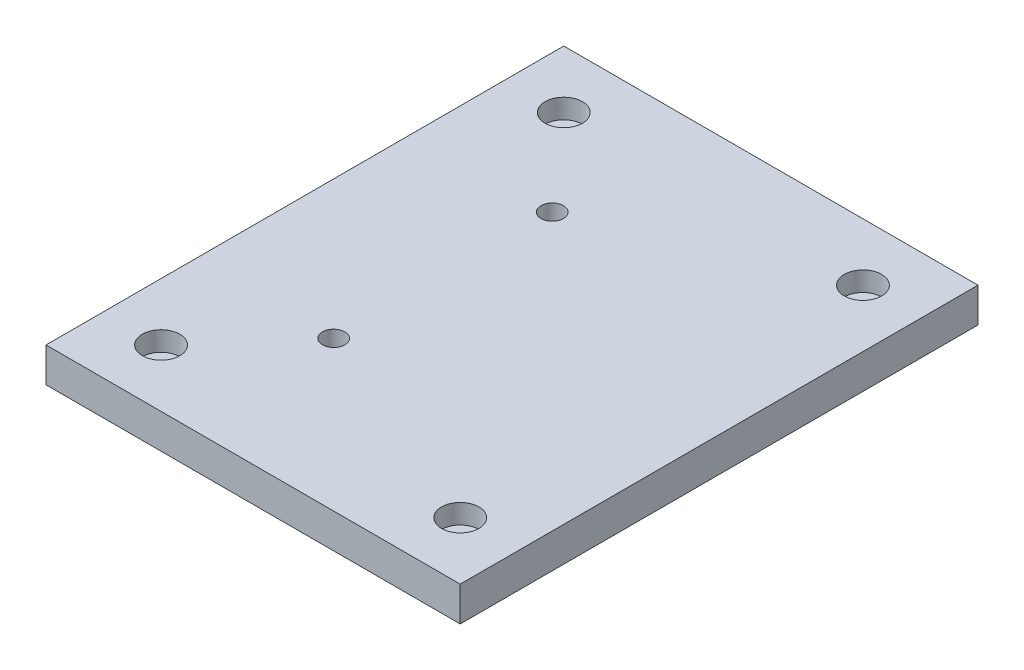
ISO-10303-21;
HEADER;
FILE_DESCRIPTION(('STEP AP214'),'2;1');
FILE_NAME('part.step','',(''),(''),'','','');
FILE_SCHEMA(('AUTOMOTIVE_DESIGN { 1 0 10303 214 1 1 1 1 }'));
ENDSEC;
DATA;
#1=APPLICATION_CONTEXT('core data for automotive mechanical design processes');
#2=APPLICATION_PROTOCOL_DEFINITION('international standard','automotive_design',2000,#1);
#3=PRODUCT_CONTEXT('',#1,'mechanical');
#4=PRODUCT('Part','Part','',(#3));
#5=PRODUCT_RELATED_PRODUCT_CATEGORY('part','',(#4));
#6=PRODUCT_DEFINITION_FORMATION('','',#4);
#7=PRODUCT_DEFINITION_CONTEXT('part definition',#1,'design');
#8=PRODUCT_DEFINITION('design','',#6,#7);
#9=PRODUCT_DEFINITION_SHAPE('','',#8);
#10=(LENGTH_UNIT() NAMED_UNIT(*) SI_UNIT(.MILLI.,.METRE.));
#11=(NAMED_UNIT(*) PLANE_ANGLE_UNIT() SI_UNIT($,.RADIAN.));
#12=(NAMED_UNIT(*) SI_UNIT($,.STERADIAN.) SOLID_ANGLE_UNIT());
#13=UNCERTAINTY_MEASURE_WITH_UNIT(LENGTH_MEASURE(1.E-05),#10,'distance_accuracy_value','');
#14=(GEOMETRIC_REPRESENTATION_CONTEXT(3) GLOBAL_UNCERTAINTY_ASSIGNED_CONTEXT((#13)) GLOBAL_UNIT_ASSIGNED_CONTEXT((#10,
#11,#12)) REPRESENTATION_CONTEXT('',''));
#15=CARTESIAN_POINT('',(0.,0.,0.));
#16=DIRECTION('',(0.,0.,1.));
#17=DIRECTION('',(1.,0.,0.));
#18=AXIS2_PLACEMENT_3D('',#15,#16,#17);
#19=CARTESIAN_POINT('',(-36.,6.,-45.));
#20=DIRECTION('',(1.,0.,0.));
#21=DIRECTION('',(0.,0.,-1.));
#22=AXIS2_PLACEMENT_3D('',#19,#20,#21);
#23=PLANE('',#22);
#24=DIRECTION('',(0.,0.,1.));
#25=VECTOR('',#24,1.);
#26=CARTESIAN_POINT('',(-36.,0.,-45.));
#27=LINE('',#26,#25);
#28=CARTESIAN_POINT('',(-36.,0.,-45.));
#29=VERTEX_POINT('',#28);
#30=CARTESIAN_POINT('',(-36.,0.,45.));
#31=VERTEX_POINT('',#30);
#32=EDGE_CURVE('E116',#29,#31,#27,.T.);
#33=ORIENTED_EDGE('',*,*,#32,.T.);
#34=DIRECTION('',(0.,-1.,0.));
#35=VECTOR('',#34,1.);
#36=CARTESIAN_POINT('',(-36.,6.,45.));
#37=LINE('',#36,#35);
#38=CARTESIAN_POINT('',(-36.,6.,45.));
#39=VERTEX_POINT('',#38);
#40=EDGE_CURVE('E11',#39,#31,#37,.T.);
#41=ORIENTED_EDGE('',*,*,#40,.F.);
#42=DIRECTION('',(0.,0.,1.));
#43=VECTOR('',#42,1.);
#44=CARTESIAN_POINT('',(-36.,6.,-45.));
#45=LINE('',#44,#43);
#46=CARTESIAN_POINT('',(-36.,6.,-45.));
#47=VERTEX_POINT('',#46);
#48=EDGE_CURVE('E99',#47,#39,#45,.T.);
#49=ORIENTED_EDGE('',*,*,#48,.F.);
#50=DIRECTION('',(0.,-1.,0.));
#51=VECTOR('',#50,1.);
#52=CARTESIAN_POINT('',(-36.,6.,-45.));
#53=LINE('',#52,#51);
#54=EDGE_CURVE('E112',#47,#29,#53,.T.);
#55=ORIENTED_EDGE('',*,*,#54,.T.);
#56=EDGE_LOOP('',(#33,#41,#49,#55));
#57=FACE_BOUND('',#56,.T.);
#58=ADVANCED_FACE('F45',(#57),#23,.F.);
#59=CARTESIAN_POINT('',(-36.,6.,45.));
#60=DIRECTION('',(0.,0.,-1.));
#61=DIRECTION('',(-1.,0.,0.));
#62=AXIS2_PLACEMENT_3D('',#59,#60,#61);
#63=PLANE('',#62);
#64=DIRECTION('',(1.,0.,0.));
#65=VECTOR('',#64,1.);
#66=CARTESIAN_POINT('',(-36.,0.,45.));
#67=LINE('',#66,#65);
#68=CARTESIAN_POINT('',(36.,0.,45.));
#69=VERTEX_POINT('',#68);
#70=EDGE_CURVE('E104',#31,#69,#67,.T.);
#71=ORIENTED_EDGE('',*,*,#70,.T.);
#72=DIRECTION('',(0.,-1.,0.));
#73=VECTOR('',#72,1.);
#74=CARTESIAN_POINT('',(36.,6.,45.));
#75=LINE('',#74,#73);
#76=CARTESIAN_POINT('',(36.,6.,45.));
#77=VERTEX_POINT('',#76);
#78=EDGE_CURVE('E55',#77,#69,#75,.T.);
#79=ORIENTED_EDGE('',*,*,#78,.F.);
#80=DIRECTION('',(1.,0.,0.));
#81=VECTOR('',#80,1.);
#82=CARTESIAN_POINT('',(-36.,6.,45.));
#83=LINE('',#82,#81);
#84=EDGE_CURVE('E94',#39,#77,#83,.T.);
#85=ORIENTED_EDGE('',*,*,#84,.F.);
#86=ORIENTED_EDGE('',*,*,#40,.T.);
#87=EDGE_LOOP('',(#71,#79,#85,#86));
#88=FACE_BOUND('',#87,.T.);
#89=ADVANCED_FACE('F103',(#88),#63,.F.);
#90=CARTESIAN_POINT('',(36.,6.,-45.));
#91=DIRECTION('',(-1.,0.,0.));
#92=DIRECTION('',(0.,0.,1.));
#93=AXIS2_PLACEMENT_3D('',#90,#91,#92);
#94=PLANE('',#93);
#95=DIRECTION('',(0.,0.,-1.));
#96=VECTOR('',#95,1.);
#97=CARTESIAN_POINT('',(36.,0.,-45.));
#98=LINE('',#97,#96);
#99=CARTESIAN_POINT('',(36.,0.,-45.));
#100=VERTEX_POINT('',#99);
#101=EDGE_CURVE('E81',#69,#100,#98,.T.);
#102=ORIENTED_EDGE('',*,*,#101,.T.);
#103=DIRECTION('',(0.,-1.,0.));
#104=VECTOR('',#103,1.);
#105=CARTESIAN_POINT('',(36.,6.,-45.));
#106=LINE('',#105,#104);
#107=CARTESIAN_POINT('',(36.,6.,-45.));
#108=VERTEX_POINT('',#107);
#109=EDGE_CURVE('E106',#108,#100,#106,.T.);
#110=ORIENTED_EDGE('',*,*,#109,.F.);
#111=DIRECTION('',(0.,0.,-1.));
#112=VECTOR('',#111,1.);
#113=CARTESIAN_POINT('',(36.,6.,-45.));
#114=LINE('',#113,#112);
#115=EDGE_CURVE('E97',#77,#108,#114,.T.);
#116=ORIENTED_EDGE('',*,*,#115,.F.);
#117=ORIENTED_EDGE('',*,*,#78,.T.);
#118=EDGE_LOOP('',(#102,#110,#116,#117));
#119=FACE_BOUND('',#118,.T.);
#120=ADVANCED_FACE('F108',(#119),#94,.F.);
#121=CARTESIAN_POINT('',(-36.,6.,-45.));
#122=DIRECTION('',(0.,0.,1.));
#123=DIRECTION('',(1.,0.,0.));
#124=AXIS2_PLACEMENT_3D('',#121,#122,#123);
#125=PLANE('',#124);
#126=DIRECTION('',(-1.,0.,0.));
#127=VECTOR('',#126,1.);
#128=CARTESIAN_POINT('',(-36.,0.,-45.));
#129=LINE('',#128,#127);
#130=EDGE_CURVE('E87',#100,#29,#129,.T.);
#131=ORIENTED_EDGE('',*,*,#130,.T.);
#132=ORIENTED_EDGE('',*,*,#54,.F.);
#133=DIRECTION('',(-1.,0.,0.));
#134=VECTOR('',#133,1.);
#135=CARTESIAN_POINT('',(-36.,6.,-45.));
#136=LINE('',#135,#134);
#137=EDGE_CURVE('E64',#108,#47,#136,.T.);
#138=ORIENTED_EDGE('',*,*,#137,.F.);
#139=ORIENTED_EDGE('',*,*,#109,.T.);
#140=EDGE_LOOP('',(#131,#132,#138,#139));
#141=FACE_BOUND('',#140,.T.);
#142=ADVANCED_FACE('F199',(#141),#125,.F.);
#143=CARTESIAN_POINT('',(0.,6.,0.));
#144=DIRECTION('',(0.,1.,0.));
#145=DIRECTION('',(0.,0.,1.));
#146=AXIS2_PLACEMENT_3D('',#143,#144,#145);
#147=PLANE('',#146);
#148=CARTESIAN_POINT('',(-12.,6.,19.));
#149=DIRECTION('',(0.,1.,0.));
#150=DIRECTION('',(0.,0.,1.));
#151=AXIS2_PLACEMENT_3D('',#148,#149,#150);
#152=CIRCLE('',#151,1.95);
#153=CARTESIAN_POINT('',(-12.,6.,20.95));
#154=VERTEX_POINT('',#153);
#155=EDGE_CURVE('E355',#154,#154,#152,.T.);
#156=ORIENTED_EDGE('',*,*,#155,.F.);
#157=EDGE_LOOP('',(#156));
#158=FACE_BOUND('',#157,.T.);
#159=CARTESIAN_POINT('',(-12.,6.,-19.));
#160=DIRECTION('',(0.,1.,0.));
#161=DIRECTION('',(0.,0.,1.));
#162=AXIS2_PLACEMENT_3D('',#159,#160,#161);
#163=CIRCLE('',#162,1.95);
#164=CARTESIAN_POINT('',(-12.,6.,-17.05));
#165=VERTEX_POINT('',#164);
#166=EDGE_CURVE('E359',#165,#165,#163,.T.);
#167=ORIENTED_EDGE('',*,*,#166,.F.);
#168=EDGE_LOOP('',(#167));
#169=FACE_BOUND('',#168,.T.);
#170=CARTESIAN_POINT('',(-26.,6.,-35.));
#171=DIRECTION('',(0.,1.,0.));
#172=DIRECTION('',(0.,0.,1.));
#173=AXIS2_PLACEMENT_3D('',#170,#171,#172);
#174=CIRCLE('',#173,3.25);
#175=CARTESIAN_POINT('',(-26.,6.,-31.75));
#176=VERTEX_POINT('',#175);
#177=EDGE_CURVE('E369',#176,#176,#174,.T.);
#178=ORIENTED_EDGE('',*,*,#177,.F.);
#179=EDGE_LOOP('',(#178));
#180=FACE_BOUND('',#179,.T.);
#181=CARTESIAN_POINT('',(26.,6.,-35.));
#182=DIRECTION('',(0.,1.,0.));
#183=DIRECTION('',(0.,0.,1.));
#184=AXIS2_PLACEMENT_3D('',#181,#182,#183);
#185=CIRCLE('',#184,3.25);
#186=CARTESIAN_POINT('',(26.,6.,-31.75));
#187=VERTEX_POINT('',#186);
#188=EDGE_CURVE('E159',#187,#187,#185,.T.);
#189=ORIENTED_EDGE('',*,*,#188,.F.);
#190=EDGE_LOOP('',(#189));
#191=FACE_BOUND('',#190,.T.);
#192=CARTESIAN_POINT('',(26.,6.,35.));
#193=DIRECTION('',(0.,1.,0.));
#194=DIRECTION('',(0.,0.,1.));
#195=AXIS2_PLACEMENT_3D('',#192,#193,#194);
#196=CIRCLE('',#195,3.25);
#197=CARTESIAN_POINT('',(26.,6.,38.25));
#198=VERTEX_POINT('',#197);
#199=EDGE_CURVE('E143',#198,#198,#196,.T.);
#200=ORIENTED_EDGE('',*,*,#199,.F.);
#201=EDGE_LOOP('',(#200));
#202=FACE_BOUND('',#201,.T.);
#203=CARTESIAN_POINT('',(-26.,6.,35.));
#204=DIRECTION('',(0.,1.,0.));
#205=DIRECTION('',(0.,0.,1.));
#206=AXIS2_PLACEMENT_3D('',#203,#204,#205);
#207=CIRCLE('',#206,3.25);
#208=CARTESIAN_POINT('',(-26.,6.,38.25));
#209=VERTEX_POINT('',#208);
#210=EDGE_CURVE('E138',#209,#209,#207,.T.);
#211=ORIENTED_EDGE('',*,*,#210,.F.);
#212=EDGE_LOOP('',(#211));
#213=FACE_BOUND('',#212,.T.);
#214=ORIENTED_EDGE('',*,*,#48,.T.);
#215=ORIENTED_EDGE('',*,*,#84,.T.);
#216=ORIENTED_EDGE('',*,*,#115,.T.);
#217=ORIENTED_EDGE('',*,*,#137,.T.);
#218=EDGE_LOOP('',(#214,#215,#216,#217));
#219=FACE_BOUND('',#218,.T.);
#220=ADVANCED_FACE('F95',(#158,#169,#180,#191,#202,#213,#219),#147,.T.);
#221=CARTESIAN_POINT('',(0.,0.,0.));
#222=DIRECTION('',(0.,1.,0.));
#223=DIRECTION('',(0.,0.,1.));
#224=AXIS2_PLACEMENT_3D('',#221,#222,#223);
#225=PLANE('',#224);
#226=CARTESIAN_POINT('',(-12.,0.,19.));
#227=DIRECTION('',(0.,1.,0.));
#228=DIRECTION('',(0.,0.,1.));
#229=AXIS2_PLACEMENT_3D('',#226,#227,#228);
#230=CIRCLE('',#229,1.95);
#231=CARTESIAN_POINT('',(-12.,0.,20.95));
#232=VERTEX_POINT('',#231);
#233=EDGE_CURVE('E353',#232,#232,#230,.T.);
#234=ORIENTED_EDGE('',*,*,#233,.T.);
#235=EDGE_LOOP('',(#234));
#236=FACE_BOUND('',#235,.T.);
#237=CARTESIAN_POINT('',(-12.,0.,-19.));
#238=DIRECTION('',(0.,1.,0.));
#239=DIRECTION('',(0.,0.,1.));
#240=AXIS2_PLACEMENT_3D('',#237,#238,#239);
#241=CIRCLE('',#240,1.95);
#242=CARTESIAN_POINT('',(-12.,0.,-17.05));
#243=VERTEX_POINT('',#242);
#244=EDGE_CURVE('E365',#243,#243,#241,.T.);
#245=ORIENTED_EDGE('',*,*,#244,.T.);
#246=EDGE_LOOP('',(#245));
#247=FACE_BOUND('',#246,.T.);
#248=CARTESIAN_POINT('',(-26.,0.,-35.));
#249=DIRECTION('',(0.,1.,0.));
#250=DIRECTION('',(0.,0.,1.));
#251=AXIS2_PLACEMENT_3D('',#248,#249,#250);
#252=CIRCLE('',#251,1.6);
#253=CARTESIAN_POINT('',(-26.,0.,-33.4));
#254=VERTEX_POINT('',#253);
#255=EDGE_CURVE('E48',#254,#254,#252,.T.);
#256=ORIENTED_EDGE('',*,*,#255,.T.);
#257=EDGE_LOOP('',(#256));
#258=FACE_BOUND('',#257,.T.);
#259=CARTESIAN_POINT('',(26.,0.,-35.));
#260=DIRECTION('',(0.,1.,0.));
#261=DIRECTION('',(0.,0.,1.));
#262=AXIS2_PLACEMENT_3D('',#259,#260,#261);
#263=CIRCLE('',#262,1.6);
#264=CARTESIAN_POINT('',(26.,0.,-33.4));
#265=VERTEX_POINT('',#264);
#266=EDGE_CURVE('E140',#265,#265,#263,.T.);
#267=ORIENTED_EDGE('',*,*,#266,.T.);
#268=EDGE_LOOP('',(#267));
#269=FACE_BOUND('',#268,.T.);
#270=CARTESIAN_POINT('',(26.,0.,35.));
#271=DIRECTION('',(0.,1.,0.));
#272=DIRECTION('',(0.,0.,1.));
#273=AXIS2_PLACEMENT_3D('',#270,#271,#272);
#274=CIRCLE('',#273,1.6);
#275=CARTESIAN_POINT('',(26.,0.,36.6));
#276=VERTEX_POINT('',#275);
#277=EDGE_CURVE('E135',#276,#276,#274,.T.);
#278=ORIENTED_EDGE('',*,*,#277,.T.);
#279=EDGE_LOOP('',(#278));
#280=FACE_BOUND('',#279,.T.);
#281=CARTESIAN_POINT('',(-26.,0.,35.));
#282=DIRECTION('',(0.,1.,0.));
#283=DIRECTION('',(0.,0.,1.));
#284=AXIS2_PLACEMENT_3D('',#281,#282,#283);
#285=CIRCLE('',#284,1.6);
#286=CARTESIAN_POINT('',(-26.,0.,36.6));
#287=VERTEX_POINT('',#286);
#288=EDGE_CURVE('E120',#287,#287,#285,.T.);
#289=ORIENTED_EDGE('',*,*,#288,.T.);
#290=EDGE_LOOP('',(#289));
#291=FACE_BOUND('',#290,.T.);
#292=ORIENTED_EDGE('',*,*,#32,.F.);
#293=ORIENTED_EDGE('',*,*,#130,.F.);
#294=ORIENTED_EDGE('',*,*,#101,.F.);
#295=ORIENTED_EDGE('',*,*,#70,.F.);
#296=EDGE_LOOP('',(#292,#293,#294,#295));
#297=FACE_BOUND('',#296,.T.);
#298=ADVANCED_FACE('F198',(#236,#247,#258,#269,#280,#291,#297),#225,.F.);
#299=CARTESIAN_POINT('',(-26.,6.,35.));
#300=DIRECTION('',(0.,1.,0.));
#301=DIRECTION('',(0.,0.,1.));
#302=AXIS2_PLACEMENT_3D('',#299,#300,#301);
#303=CYLINDRICAL_SURFACE('',#302,1.6);
#304=CARTESIAN_POINT('',(-26.,2.6,35.));
#305=DIRECTION('',(0.,1.,0.));
#306=DIRECTION('',(0.,0.,1.));
#307=AXIS2_PLACEMENT_3D('',#304,#305,#306);
#308=CIRCLE('',#307,1.6);
#309=CARTESIAN_POINT('',(-26.,2.6,36.6));
#310=VERTEX_POINT('',#309);
#311=EDGE_CURVE('E134',#310,#310,#308,.T.);
#312=ORIENTED_EDGE('',*,*,#311,.T.);
#313=EDGE_LOOP('',(#312));
#314=FACE_BOUND('',#313,.T.);
#315=ORIENTED_EDGE('',*,*,#288,.F.);
#316=EDGE_LOOP('',(#315));
#317=FACE_BOUND('',#316,.T.);
#318=ADVANCED_FACE('F181',(#314,#317),#303,.F.);
#319=CARTESIAN_POINT('',(-24.4,2.6,35.));
#320=DIRECTION('',(0.,-1.,0.));
#321=DIRECTION('',(0.,0.,-1.));
#322=AXIS2_PLACEMENT_3D('',#319,#320,#321);
#323=PLANE('',#322);
#324=ORIENTED_EDGE('',*,*,#311,.F.);
#325=EDGE_LOOP('',(#324));
#326=FACE_BOUND('',#325,.T.);
#327=CARTESIAN_POINT('',(-26.,2.6,35.));
#328=DIRECTION('',(0.,1.,0.));
#329=DIRECTION('',(0.,0.,1.));
#330=AXIS2_PLACEMENT_3D('',#327,#328,#329);
#331=CIRCLE('',#330,3.25);
#332=CARTESIAN_POINT('',(-26.,2.6,38.25));
#333=VERTEX_POINT('',#332);
#334=EDGE_CURVE('E172',#333,#333,#331,.T.);
#335=ORIENTED_EDGE('',*,*,#334,.T.);
#336=EDGE_LOOP('',(#335));
#337=FACE_BOUND('',#336,.T.);
#338=ADVANCED_FACE('F184',(#326,#337),#323,.F.);
#339=CARTESIAN_POINT('',(-26.,6.,35.));
#340=DIRECTION('',(0.,1.,0.));
#341=DIRECTION('',(0.,0.,1.));
#342=AXIS2_PLACEMENT_3D('',#339,#340,#341);
#343=CYLINDRICAL_SURFACE('',#342,3.25);
#344=ORIENTED_EDGE('',*,*,#334,.F.);
#345=EDGE_LOOP('',(#344));
#346=FACE_BOUND('',#345,.T.);
#347=ORIENTED_EDGE('',*,*,#210,.T.);
#348=EDGE_LOOP('',(#347));
#349=FACE_BOUND('',#348,.T.);
#350=ADVANCED_FACE('F187',(#346,#349),#343,.F.);
#351=CARTESIAN_POINT('',(26.,6.,35.));
#352=DIRECTION('',(0.,1.,0.));
#353=DIRECTION('',(0.,0.,1.));
#354=AXIS2_PLACEMENT_3D('',#351,#352,#353);
#355=CYLINDRICAL_SURFACE('',#354,1.6);
#356=CARTESIAN_POINT('',(26.,2.6,35.));
#357=DIRECTION('',(0.,1.,0.));
#358=DIRECTION('',(0.,0.,1.));
#359=AXIS2_PLACEMENT_3D('',#356,#357,#358);
#360=CIRCLE('',#359,1.6);
#361=CARTESIAN_POINT('',(26.,2.6,36.6));
#362=VERTEX_POINT('',#361);
#363=EDGE_CURVE('E139',#362,#362,#360,.T.);
#364=ORIENTED_EDGE('',*,*,#363,.T.);
#365=EDGE_LOOP('',(#364));
#366=FACE_BOUND('',#365,.T.);
#367=ORIENTED_EDGE('',*,*,#277,.F.);
#368=EDGE_LOOP('',(#367));
#369=FACE_BOUND('',#368,.T.);
#370=ADVANCED_FACE('F193',(#366,#369),#355,.F.);
#371=CARTESIAN_POINT('',(27.6,2.6,35.));
#372=DIRECTION('',(0.,-1.,0.));
#373=DIRECTION('',(0.,0.,-1.));
#374=AXIS2_PLACEMENT_3D('',#371,#372,#373);
#375=PLANE('',#374);
#376=ORIENTED_EDGE('',*,*,#363,.F.);
#377=EDGE_LOOP('',(#376));
#378=FACE_BOUND('',#377,.T.);
#379=CARTESIAN_POINT('',(26.,2.6,35.));
#380=DIRECTION('',(0.,1.,0.));
#381=DIRECTION('',(0.,0.,1.));
#382=AXIS2_PLACEMENT_3D('',#379,#380,#381);
#383=CIRCLE('',#382,3.25);
#384=CARTESIAN_POINT('',(26.,2.6,38.25));
#385=VERTEX_POINT('',#384);
#386=EDGE_CURVE('E150',#385,#385,#383,.T.);
#387=ORIENTED_EDGE('',*,*,#386,.T.);
#388=EDGE_LOOP('',(#387));
#389=FACE_BOUND('',#388,.T.);
#390=ADVANCED_FACE('F255',(#378,#389),#375,.F.);
#391=CARTESIAN_POINT('',(26.,6.,35.));
#392=DIRECTION('',(0.,1.,0.));
#393=DIRECTION('',(0.,0.,1.));
#394=AXIS2_PLACEMENT_3D('',#391,#392,#393);
#395=CYLINDRICAL_SURFACE('',#394,3.25);
#396=ORIENTED_EDGE('',*,*,#386,.F.);
#397=EDGE_LOOP('',(#396));
#398=FACE_BOUND('',#397,.T.);
#399=ORIENTED_EDGE('',*,*,#199,.T.);
#400=EDGE_LOOP('',(#399));
#401=FACE_BOUND('',#400,.T.);
#402=ADVANCED_FACE('F264',(#398,#401),#395,.F.);
#403=CARTESIAN_POINT('',(26.,6.,-35.));
#404=DIRECTION('',(0.,1.,0.));
#405=DIRECTION('',(0.,0.,1.));
#406=AXIS2_PLACEMENT_3D('',#403,#404,#405);
#407=CYLINDRICAL_SURFACE('',#406,1.6);
#408=CARTESIAN_POINT('',(26.,2.6,-35.));
#409=DIRECTION('',(0.,1.,0.));
#410=DIRECTION('',(0.,0.,1.));
#411=AXIS2_PLACEMENT_3D('',#408,#409,#410);
#412=CIRCLE('',#411,1.6);
#413=CARTESIAN_POINT('',(26.,2.6,-33.4));
#414=VERTEX_POINT('',#413);
#415=EDGE_CURVE('E144',#414,#414,#412,.T.);
#416=ORIENTED_EDGE('',*,*,#415,.T.);
#417=EDGE_LOOP('',(#416));
#418=FACE_BOUND('',#417,.T.);
#419=ORIENTED_EDGE('',*,*,#266,.F.);
#420=EDGE_LOOP('',(#419));
#421=FACE_BOUND('',#420,.T.);
#422=ADVANCED_FACE('F273',(#418,#421),#407,.F.);
#423=CARTESIAN_POINT('',(27.6,2.6,-35.));
#424=DIRECTION('',(0.,-1.,0.));
#425=DIRECTION('',(0.,0.,-1.));
#426=AXIS2_PLACEMENT_3D('',#423,#424,#425);
#427=PLANE('',#426);
#428=ORIENTED_EDGE('',*,*,#415,.F.);
#429=EDGE_LOOP('',(#428));
#430=FACE_BOUND('',#429,.T.);
#431=CARTESIAN_POINT('',(26.,2.6,-35.));
#432=DIRECTION('',(0.,1.,0.));
#433=DIRECTION('',(0.,0.,1.));
#434=AXIS2_PLACEMENT_3D('',#431,#432,#433);
#435=CIRCLE('',#434,3.25);
#436=CARTESIAN_POINT('',(26.,2.6,-31.75));
#437=VERTEX_POINT('',#436);
#438=EDGE_CURVE('E153',#437,#437,#435,.T.);
#439=ORIENTED_EDGE('',*,*,#438,.T.);
#440=EDGE_LOOP('',(#439));
#441=FACE_BOUND('',#440,.T.);
#442=ADVANCED_FACE('F282',(#430,#441),#427,.F.);
#443=CARTESIAN_POINT('',(26.,6.,-35.));
#444=DIRECTION('',(0.,1.,0.));
#445=DIRECTION('',(0.,0.,1.));
#446=AXIS2_PLACEMENT_3D('',#443,#444,#445);
#447=CYLINDRICAL_SURFACE('',#446,3.25);
#448=ORIENTED_EDGE('',*,*,#438,.F.);
#449=EDGE_LOOP('',(#448));
#450=FACE_BOUND('',#449,.T.);
#451=ORIENTED_EDGE('',*,*,#188,.T.);
#452=EDGE_LOOP('',(#451));
#453=FACE_BOUND('',#452,.T.);
#454=ADVANCED_FACE('F290',(#450,#453),#447,.F.);
#455=CARTESIAN_POINT('',(-26.,6.,-35.));
#456=DIRECTION('',(0.,1.,0.));
#457=DIRECTION('',(0.,0.,1.));
#458=AXIS2_PLACEMENT_3D('',#455,#456,#457);
#459=CYLINDRICAL_SURFACE('',#458,1.6);
#460=CARTESIAN_POINT('',(-26.,2.6,-35.));
#461=DIRECTION('',(0.,1.,0.));
#462=DIRECTION('',(0.,0.,1.));
#463=AXIS2_PLACEMENT_3D('',#460,#461,#462);
#464=CIRCLE('',#463,1.6);
#465=CARTESIAN_POINT('',(-26.,2.6,-33.4));
#466=VERTEX_POINT('',#465);
#467=EDGE_CURVE('E377',#466,#466,#464,.T.);
#468=ORIENTED_EDGE('',*,*,#467,.T.);
#469=EDGE_LOOP('',(#468));
#470=FACE_BOUND('',#469,.T.);
#471=ORIENTED_EDGE('',*,*,#255,.F.);
#472=EDGE_LOOP('',(#471));
#473=FACE_BOUND('',#472,.T.);
#474=ADVANCED_FACE('F299',(#470,#473),#459,.F.);
#475=CARTESIAN_POINT('',(-24.4,2.6,-35.));
#476=DIRECTION('',(0.,-1.,0.));
#477=DIRECTION('',(0.,0.,-1.));
#478=AXIS2_PLACEMENT_3D('',#475,#476,#477);
#479=PLANE('',#478);
#480=ORIENTED_EDGE('',*,*,#467,.F.);
#481=EDGE_LOOP('',(#480));
#482=FACE_BOUND('',#481,.T.);
#483=CARTESIAN_POINT('',(-26.,2.6,-35.));
#484=DIRECTION('',(0.,1.,0.));
#485=DIRECTION('',(0.,0.,1.));
#486=AXIS2_PLACEMENT_3D('',#483,#484,#485);
#487=CIRCLE('',#486,3.25);
#488=CARTESIAN_POINT('',(-26.,2.6,-31.75));
#489=VERTEX_POINT('',#488);
#490=EDGE_CURVE('E373',#489,#489,#487,.T.);
#491=ORIENTED_EDGE('',*,*,#490,.T.);
#492=EDGE_LOOP('',(#491));
#493=FACE_BOUND('',#492,.T.);
#494=ADVANCED_FACE('F308',(#482,#493),#479,.F.);
#495=CARTESIAN_POINT('',(-26.,6.,-35.));
#496=DIRECTION('',(0.,1.,0.));
#497=DIRECTION('',(0.,0.,1.));
#498=AXIS2_PLACEMENT_3D('',#495,#496,#497);
#499=CYLINDRICAL_SURFACE('',#498,3.25);
#500=ORIENTED_EDGE('',*,*,#490,.F.);
#501=EDGE_LOOP('',(#500));
#502=FACE_BOUND('',#501,.T.);
#503=ORIENTED_EDGE('',*,*,#177,.T.);
#504=EDGE_LOOP('',(#503));
#505=FACE_BOUND('',#504,.T.);
#506=ADVANCED_FACE('F316',(#502,#505),#499,.F.);
#507=CARTESIAN_POINT('',(-12.,6.,-19.));
#508=DIRECTION('',(0.,1.,0.));
#509=DIRECTION('',(0.,0.,1.));
#510=AXIS2_PLACEMENT_3D('',#507,#508,#509);
#511=CYLINDRICAL_SURFACE('',#510,1.95);
#512=ORIENTED_EDGE('',*,*,#244,.F.);
#513=EDGE_LOOP('',(#512));
#514=FACE_BOUND('',#513,.T.);
#515=ORIENTED_EDGE('',*,*,#166,.T.);
#516=EDGE_LOOP('',(#515));
#517=FACE_BOUND('',#516,.T.);
#518=ADVANCED_FACE('F324',(#514,#517),#511,.F.);
#519=CARTESIAN_POINT('',(-12.,6.,19.));
#520=DIRECTION('',(0.,1.,0.));
#521=DIRECTION('',(0.,0.,1.));
#522=AXIS2_PLACEMENT_3D('',#519,#520,#521);
#523=CYLINDRICAL_SURFACE('',#522,1.95);
#524=ORIENTED_EDGE('',*,*,#233,.F.);
#525=EDGE_LOOP('',(#524));
#526=FACE_BOUND('',#525,.T.);
#527=ORIENTED_EDGE('',*,*,#155,.T.);
#528=EDGE_LOOP('',(#527));
#529=FACE_BOUND('',#528,.T.);
#530=ADVANCED_FACE('F337',(#526,#529),#523,.F.);
#531=CLOSED_SHELL('',(#58,#89,#120,#142,#220,#298,#318,#338,#350,#370,#390,#402,#422,#442,#454,
#474,#494,#506,#518,#530));
#532=MANIFOLD_SOLID_BREP('B2',#531);
#533=ADVANCED_BREP_SHAPE_REPRESENTATION('',(#18,#532),#14);
#534=SHAPE_DEFINITION_REPRESENTATION(#9,#533);
ENDSEC;
END-ISO-10303-21;
